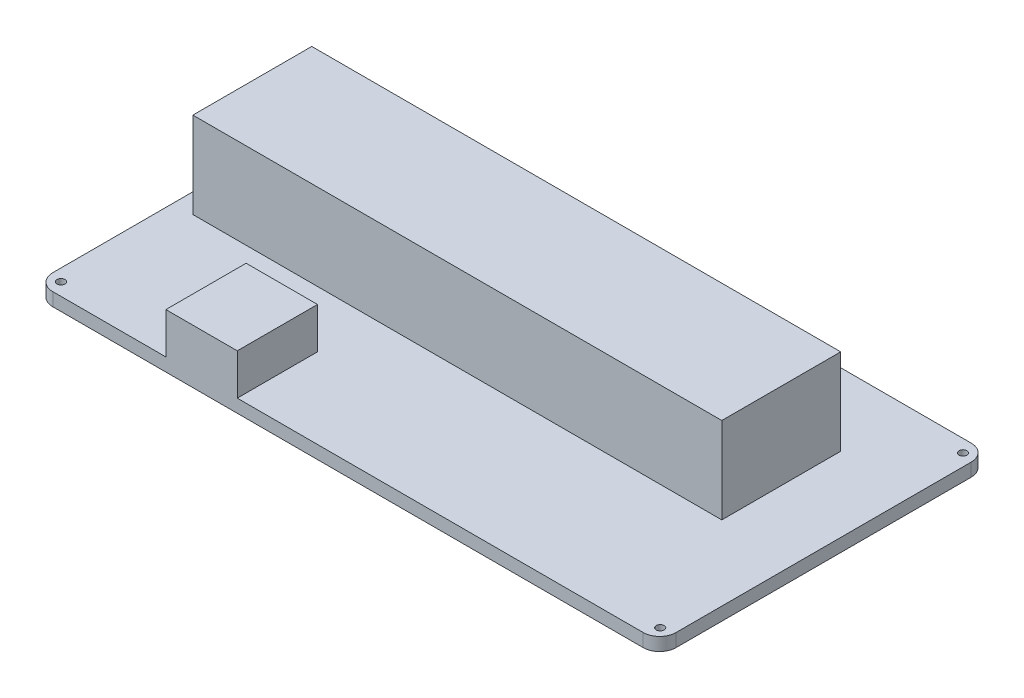
ISO-10303-21;
HEADER;
FILE_DESCRIPTION(('STEP AP214'),'2;1');
FILE_NAME('part.step','',(''),(''),'','','');
FILE_SCHEMA(('AUTOMOTIVE_DESIGN { 1 0 10303 214 1 1 1 1 }'));
ENDSEC;
DATA;
#1=APPLICATION_CONTEXT('core data for automotive mechanical design processes');
#2=APPLICATION_PROTOCOL_DEFINITION('international standard','automotive_design',2000,#1);
#3=PRODUCT_CONTEXT('',#1,'mechanical');
#4=PRODUCT('Part','Part','',(#3));
#5=PRODUCT_RELATED_PRODUCT_CATEGORY('part','',(#4));
#6=PRODUCT_DEFINITION_FORMATION('','',#4);
#7=PRODUCT_DEFINITION_CONTEXT('part definition',#1,'design');
#8=PRODUCT_DEFINITION('design','',#6,#7);
#9=PRODUCT_DEFINITION_SHAPE('','',#8);
#10=(LENGTH_UNIT() NAMED_UNIT(*) SI_UNIT(.MILLI.,.METRE.));
#11=(NAMED_UNIT(*) PLANE_ANGLE_UNIT() SI_UNIT($,.RADIAN.));
#12=(NAMED_UNIT(*) SI_UNIT($,.STERADIAN.) SOLID_ANGLE_UNIT());
#13=UNCERTAINTY_MEASURE_WITH_UNIT(LENGTH_MEASURE(1.E-05),#10,'distance_accuracy_value','');
#14=(GEOMETRIC_REPRESENTATION_CONTEXT(3) GLOBAL_UNCERTAINTY_ASSIGNED_CONTEXT((#13)) GLOBAL_UNIT_ASSIGNED_CONTEXT((#10,
#11,#12)) REPRESENTATION_CONTEXT('',''));
#15=CARTESIAN_POINT('',(0.,0.,0.));
#16=DIRECTION('',(0.,0.,1.));
#17=DIRECTION('',(1.,0.,0.));
#18=AXIS2_PLACEMENT_3D('',#15,#16,#17);
#19=CARTESIAN_POINT('',(0.,1.6,0.));
#20=DIRECTION('',(0.,1.,0.));
#21=DIRECTION('',(0.,0.,1.));
#22=AXIS2_PLACEMENT_3D('',#19,#20,#21);
#23=PLANE('',#22);
#24=DIRECTION('',(1.,0.,0.));
#25=VECTOR('',#24,1.);
#26=CARTESIAN_POINT('',(0.,1.6,3.31710182875458));
#27=LINE('',#26,#25);
#28=CARTESIAN_POINT('',(-35.6,1.6,3.31710182875459));
#29=VERTEX_POINT('',#28);
#30=CARTESIAN_POINT('',(28.9,1.6,3.31710182875456));
#31=VERTEX_POINT('',#30);
#32=EDGE_CURVE('E269',#29,#31,#27,.T.);
#33=ORIENTED_EDGE('',*,*,#32,.F.);
#34=DIRECTION('',(0.,0.,1.));
#35=VECTOR('',#34,1.);
#36=CARTESIAN_POINT('',(-35.6,1.6,0.));
#37=LINE('',#36,#35);
#38=CARTESIAN_POINT('',(-35.6,1.6,-11.1828981712454));
#39=VERTEX_POINT('',#38);
#40=EDGE_CURVE('E266',#39,#29,#37,.T.);
#41=ORIENTED_EDGE('',*,*,#40,.F.);
#42=DIRECTION('',(1.,0.,0.));
#43=VECTOR('',#42,1.);
#44=CARTESIAN_POINT('',(0.,1.6,-11.1828981712454));
#45=LINE('',#44,#43);
#46=CARTESIAN_POINT('',(28.9,1.6,-11.1828981712454));
#47=VERTEX_POINT('',#46);
#48=EDGE_CURVE('E262',#39,#47,#45,.T.);
#49=ORIENTED_EDGE('',*,*,#48,.T.);
#50=DIRECTION('',(0.,0.,1.));
#51=VECTOR('',#50,1.);
#52=CARTESIAN_POINT('',(28.9,1.6,0.));
#53=LINE('',#52,#51);
#54=EDGE_CURVE('E243',#47,#31,#53,.T.);
#55=ORIENTED_EDGE('',*,*,#54,.T.);
#56=EDGE_LOOP('',(#33,#41,#49,#55));
#57=FACE_BOUND('',#56,.T.);
#58=CARTESIAN_POINT('',(36.5339011806264,1.6,-18.4594263243894));
#59=DIRECTION('',(0.,1.,0.));
#60=DIRECTION('',(0.,0.,-1.));
#61=AXIS2_PLACEMENT_3D('',#58,#59,#60);
#62=CIRCLE('',#61,0.479748543202235);
#63=CARTESIAN_POINT('',(36.5339011806264,1.6,-18.9391748675916));
#64=VERTEX_POINT('',#63);
#65=EDGE_CURVE('E273',#64,#64,#62,.T.);
#66=ORIENTED_EDGE('',*,*,#65,.F.);
#67=EDGE_LOOP('',(#66));
#68=FACE_BOUND('',#67,.T.);
#69=CARTESIAN_POINT('',(36.5339011806264,1.6,18.4594263243894));
#70=DIRECTION('',(0.,-1.,0.));
#71=DIRECTION('',(0.,0.,1.));
#72=AXIS2_PLACEMENT_3D('',#69,#70,#71);
#73=CIRCLE('',#72,0.479748543202235);
#74=CARTESIAN_POINT('',(36.5339011806264,1.6,18.9391748675916));
#75=VERTEX_POINT('',#74);
#76=EDGE_CURVE('E278',#75,#75,#73,.T.);
#77=ORIENTED_EDGE('',*,*,#76,.T.);
#78=EDGE_LOOP('',(#77));
#79=FACE_BOUND('',#78,.T.);
#80=CARTESIAN_POINT('',(-36.5339011806264,1.6,-18.4594263243894));
#81=DIRECTION('',(0.,-1.,0.));
#82=DIRECTION('',(0.,0.,-1.));
#83=AXIS2_PLACEMENT_3D('',#80,#81,#82);
#84=CIRCLE('',#83,0.479748543202235);
#85=CARTESIAN_POINT('',(-36.5339011806264,1.6,-18.9391748675916));
#86=VERTEX_POINT('',#85);
#87=EDGE_CURVE('E286',#86,#86,#84,.T.);
#88=ORIENTED_EDGE('',*,*,#87,.T.);
#89=EDGE_LOOP('',(#88));
#90=FACE_BOUND('',#89,.T.);
#91=CARTESIAN_POINT('',(-36.5339011806264,1.6,18.4594263243894));
#92=DIRECTION('',(0.,1.,0.));
#93=DIRECTION('',(0.,0.,1.));
#94=AXIS2_PLACEMENT_3D('',#91,#92,#93);
#95=CIRCLE('',#94,0.479748543202235);
#96=CARTESIAN_POINT('',(-36.5339011806264,1.6,18.9391748675916));
#97=VERTEX_POINT('',#96);
#98=EDGE_CURVE('E294',#97,#97,#95,.T.);
#99=ORIENTED_EDGE('',*,*,#98,.F.);
#100=EDGE_LOOP('',(#99));
#101=FACE_BOUND('',#100,.T.);
#102=DIRECTION('',(-1.,0.,0.));
#103=VECTOR('',#102,1.);
#104=CARTESIAN_POINT('',(-13.5,1.6,10.2152470039414));
#105=LINE('',#104,#103);
#106=CARTESIAN_POINT('',(-13.5,1.6,10.2152470039414));
#107=VERTEX_POINT('',#106);
#108=CARTESIAN_POINT('',(-22.2075198077629,1.6,10.2152470039414));
#109=VERTEX_POINT('',#108);
#110=EDGE_CURVE('E57',#107,#109,#105,.T.);
#111=ORIENTED_EDGE('',*,*,#110,.F.);
#112=DIRECTION('',(0.,0.,-1.));
#113=VECTOR('',#112,1.);
#114=CARTESIAN_POINT('',(-13.5,1.6,10.2152470039414));
#115=LINE('',#114,#113);
#116=CARTESIAN_POINT('',(-13.5,1.6,20.));
#117=VERTEX_POINT('',#116);
#118=EDGE_CURVE('E200',#117,#107,#115,.T.);
#119=ORIENTED_EDGE('',*,*,#118,.F.);
#120=DIRECTION('',(1.,0.,0.));
#121=VECTOR('',#120,1.);
#122=CARTESIAN_POINT('',(-38.,1.6,20.));
#123=LINE('',#122,#121);
#124=CARTESIAN_POINT('',(36.,1.6,20.));
#125=VERTEX_POINT('',#124);
#126=EDGE_CURVE('E319',#117,#125,#123,.T.);
#127=ORIENTED_EDGE('',*,*,#126,.T.);
#128=CARTESIAN_POINT('',(36.,1.6,18.));
#129=DIRECTION('',(0.,1.,0.));
#130=DIRECTION('',(0.,0.,1.));
#131=AXIS2_PLACEMENT_3D('',#128,#129,#130);
#132=CIRCLE('',#131,2.);
#133=CARTESIAN_POINT('',(38.,1.6,18.));
#134=VERTEX_POINT('',#133);
#135=EDGE_CURVE('E369',#125,#134,#132,.T.);
#136=ORIENTED_EDGE('',*,*,#135,.T.);
#137=DIRECTION('',(0.,0.,-1.));
#138=VECTOR('',#137,1.);
#139=CARTESIAN_POINT('',(38.,1.6,-20.));
#140=LINE('',#139,#138);
#141=CARTESIAN_POINT('',(38.,1.6,-18.));
#142=VERTEX_POINT('',#141);
#143=EDGE_CURVE('E306',#134,#142,#140,.T.);
#144=ORIENTED_EDGE('',*,*,#143,.T.);
#145=CARTESIAN_POINT('',(36.,1.6,-18.));
#146=DIRECTION('',(0.,1.,0.));
#147=DIRECTION('',(0.,0.,1.));
#148=AXIS2_PLACEMENT_3D('',#145,#146,#147);
#149=CIRCLE('',#148,2.);
#150=CARTESIAN_POINT('',(36.,1.6,-20.));
#151=VERTEX_POINT('',#150);
#152=EDGE_CURVE('E372',#142,#151,#149,.T.);
#153=ORIENTED_EDGE('',*,*,#152,.T.);
#154=DIRECTION('',(-1.,0.,0.));
#155=VECTOR('',#154,1.);
#156=CARTESIAN_POINT('',(-38.,1.6,-20.));
#157=LINE('',#156,#155);
#158=CARTESIAN_POINT('',(-36.,1.6,-20.));
#159=VERTEX_POINT('',#158);
#160=EDGE_CURVE('E310',#151,#159,#157,.T.);
#161=ORIENTED_EDGE('',*,*,#160,.T.);
#162=CARTESIAN_POINT('',(-36.,1.6,-18.));
#163=DIRECTION('',(0.,1.,0.));
#164=DIRECTION('',(0.,0.,1.));
#165=AXIS2_PLACEMENT_3D('',#162,#163,#164);
#166=CIRCLE('',#165,2.);
#167=CARTESIAN_POINT('',(-38.,1.6,-18.));
#168=VERTEX_POINT('',#167);
#169=EDGE_CURVE('E366',#159,#168,#166,.T.);
#170=ORIENTED_EDGE('',*,*,#169,.T.);
#171=DIRECTION('',(0.,0.,1.));
#172=VECTOR('',#171,1.);
#173=CARTESIAN_POINT('',(-38.,1.6,-20.));
#174=LINE('',#173,#172);
#175=CARTESIAN_POINT('',(-38.,1.6,18.));
#176=VERTEX_POINT('',#175);
#177=EDGE_CURVE('E315',#168,#176,#174,.T.);
#178=ORIENTED_EDGE('',*,*,#177,.T.);
#179=CARTESIAN_POINT('',(-36.,1.6,18.));
#180=DIRECTION('',(0.,1.,0.));
#181=DIRECTION('',(0.,0.,1.));
#182=AXIS2_PLACEMENT_3D('',#179,#180,#181);
#183=CIRCLE('',#182,2.);
#184=CARTESIAN_POINT('',(-36.,1.6,20.));
#185=VERTEX_POINT('',#184);
#186=EDGE_CURVE('E363',#176,#185,#183,.T.);
#187=ORIENTED_EDGE('',*,*,#186,.T.);
#188=CARTESIAN_POINT('',(-22.2075198077629,1.6,20.));
#189=VERTEX_POINT('',#188);
#190=EDGE_CURVE('E320',#185,#189,#123,.T.);
#191=ORIENTED_EDGE('',*,*,#190,.T.);
#192=DIRECTION('',(0.,0.,1.));
#193=VECTOR('',#192,1.);
#194=CARTESIAN_POINT('',(-22.2075198077629,1.6,10.2152470039414));
#195=LINE('',#194,#193);
#196=EDGE_CURVE('E62',#109,#189,#195,.T.);
#197=ORIENTED_EDGE('',*,*,#196,.F.);
#198=EDGE_LOOP('',(#111,#119,#127,#136,#144,#153,#161,#170,#178,#187,#191,#197));
#199=FACE_BOUND('',#198,.T.);
#200=ADVANCED_FACE('F41',(#57,#68,#79,#90,#101,#199),#23,.T.);
#201=CARTESIAN_POINT('',(38.,1.6,-20.));
#202=DIRECTION('',(-1.,0.,0.));
#203=DIRECTION('',(0.,0.,1.));
#204=AXIS2_PLACEMENT_3D('',#201,#202,#203);
#205=PLANE('',#204);
#206=DIRECTION('',(0.,0.,-1.));
#207=VECTOR('',#206,1.);
#208=CARTESIAN_POINT('',(38.,0.,-20.));
#209=LINE('',#208,#207);
#210=CARTESIAN_POINT('',(38.,0.,18.));
#211=VERTEX_POINT('',#210);
#212=CARTESIAN_POINT('',(38.,0.,-18.));
#213=VERTEX_POINT('',#212);
#214=EDGE_CURVE('E302',#211,#213,#209,.T.);
#215=ORIENTED_EDGE('',*,*,#214,.T.);
#216=DIRECTION('',(0.,-1.,0.));
#217=VECTOR('',#216,1.);
#218=CARTESIAN_POINT('',(38.,1.6,-18.));
#219=LINE('',#218,#217);
#220=EDGE_CURVE('E360',#213,#142,#219,.F.);
#221=ORIENTED_EDGE('',*,*,#220,.T.);
#222=ORIENTED_EDGE('',*,*,#143,.F.);
#223=DIRECTION('',(0.,-1.,0.));
#224=VECTOR('',#223,1.);
#225=CARTESIAN_POINT('',(38.,1.6,18.));
#226=LINE('',#225,#224);
#227=EDGE_CURVE('E356',#134,#211,#226,.T.);
#228=ORIENTED_EDGE('',*,*,#227,.T.);
#229=EDGE_LOOP('',(#215,#221,#222,#228));
#230=FACE_BOUND('',#229,.T.);
#231=ADVANCED_FACE('F433',(#230),#205,.F.);
#232=CARTESIAN_POINT('',(-38.,1.6,-20.));
#233=DIRECTION('',(0.,0.,1.));
#234=DIRECTION('',(1.,0.,0.));
#235=AXIS2_PLACEMENT_3D('',#232,#233,#234);
#236=PLANE('',#235);
#237=ORIENTED_EDGE('',*,*,#160,.F.);
#238=DIRECTION('',(0.,-1.,0.));
#239=VECTOR('',#238,1.);
#240=CARTESIAN_POINT('',(36.,1.6,-20.));
#241=LINE('',#240,#239);
#242=CARTESIAN_POINT('',(36.,0.,-20.));
#243=VERTEX_POINT('',#242);
#244=EDGE_CURVE('E340',#151,#243,#241,.T.);
#245=ORIENTED_EDGE('',*,*,#244,.T.);
#246=DIRECTION('',(-1.,0.,0.));
#247=VECTOR('',#246,1.);
#248=CARTESIAN_POINT('',(-38.,0.,-20.));
#249=LINE('',#248,#247);
#250=CARTESIAN_POINT('',(-36.,0.,-20.));
#251=VERTEX_POINT('',#250);
#252=EDGE_CURVE('E327',#243,#251,#249,.T.);
#253=ORIENTED_EDGE('',*,*,#252,.T.);
#254=DIRECTION('',(0.,-1.,0.));
#255=VECTOR('',#254,1.);
#256=CARTESIAN_POINT('',(-36.,1.6,-20.));
#257=LINE('',#256,#255);
#258=EDGE_CURVE('E323',#251,#159,#257,.F.);
#259=ORIENTED_EDGE('',*,*,#258,.T.);
#260=EDGE_LOOP('',(#237,#245,#253,#259));
#261=FACE_BOUND('',#260,.T.);
#262=ADVANCED_FACE('F439',(#261),#236,.F.);
#263=CARTESIAN_POINT('',(-38.,1.6,-20.));
#264=DIRECTION('',(1.,0.,0.));
#265=DIRECTION('',(0.,0.,-1.));
#266=AXIS2_PLACEMENT_3D('',#263,#264,#265);
#267=PLANE('',#266);
#268=ORIENTED_EDGE('',*,*,#177,.F.);
#269=DIRECTION('',(0.,-1.,0.));
#270=VECTOR('',#269,1.);
#271=CARTESIAN_POINT('',(-38.,1.6,-18.));
#272=LINE('',#271,#270);
#273=CARTESIAN_POINT('',(-38.,0.,-18.));
#274=VERTEX_POINT('',#273);
#275=EDGE_CURVE('E386',#168,#274,#272,.T.);
#276=ORIENTED_EDGE('',*,*,#275,.T.);
#277=DIRECTION('',(0.,0.,1.));
#278=VECTOR('',#277,1.);
#279=CARTESIAN_POINT('',(-38.,0.,-20.));
#280=LINE('',#279,#278);
#281=CARTESIAN_POINT('',(-38.,0.,18.));
#282=VERTEX_POINT('',#281);
#283=EDGE_CURVE('E331',#274,#282,#280,.T.);
#284=ORIENTED_EDGE('',*,*,#283,.T.);
#285=DIRECTION('',(0.,-1.,0.));
#286=VECTOR('',#285,1.);
#287=CARTESIAN_POINT('',(-38.,1.6,18.));
#288=LINE('',#287,#286);
#289=EDGE_CURVE('E383',#282,#176,#288,.F.);
#290=ORIENTED_EDGE('',*,*,#289,.T.);
#291=EDGE_LOOP('',(#268,#276,#284,#290));
#292=FACE_BOUND('',#291,.T.);
#293=ADVANCED_FACE('F454',(#292),#267,.F.);
#294=CARTESIAN_POINT('',(-38.,1.6,20.));
#295=DIRECTION('',(0.,0.,-1.));
#296=DIRECTION('',(-1.,0.,0.));
#297=AXIS2_PLACEMENT_3D('',#294,#295,#296);
#298=PLANE('',#297);
#299=DIRECTION('',(1.,0.,0.));
#300=VECTOR('',#299,1.);
#301=CARTESIAN_POINT('',(-38.,0.,20.));
#302=LINE('',#301,#300);
#303=CARTESIAN_POINT('',(-36.,0.,20.));
#304=VERTEX_POINT('',#303);
#305=CARTESIAN_POINT('',(36.,0.,20.));
#306=VERTEX_POINT('',#305);
#307=EDGE_CURVE('E311',#304,#306,#302,.T.);
#308=ORIENTED_EDGE('',*,*,#307,.T.);
#309=DIRECTION('',(0.,-1.,0.));
#310=VECTOR('',#309,1.);
#311=CARTESIAN_POINT('',(36.,1.6,20.));
#312=LINE('',#311,#310);
#313=EDGE_CURVE('E379',#306,#125,#312,.F.);
#314=ORIENTED_EDGE('',*,*,#313,.T.);
#315=ORIENTED_EDGE('',*,*,#126,.F.);
#316=DIRECTION('',(0.,-1.,0.));
#317=VECTOR('',#316,1.);
#318=CARTESIAN_POINT('',(-13.5,6.6,20.));
#319=LINE('',#318,#317);
#320=CARTESIAN_POINT('',(-13.5,6.6,20.));
#321=VERTEX_POINT('',#320);
#322=EDGE_CURVE('E490',#321,#117,#319,.T.);
#323=ORIENTED_EDGE('',*,*,#322,.F.);
#324=DIRECTION('',(1.,0.,0.));
#325=VECTOR('',#324,1.);
#326=CARTESIAN_POINT('',(-13.5,6.6,20.));
#327=LINE('',#326,#325);
#328=CARTESIAN_POINT('',(-22.2075198077629,6.6,20.));
#329=VERTEX_POINT('',#328);
#330=EDGE_CURVE('E193',#329,#321,#327,.T.);
#331=ORIENTED_EDGE('',*,*,#330,.F.);
#332=DIRECTION('',(0.,-1.,0.));
#333=VECTOR('',#332,1.);
#334=CARTESIAN_POINT('',(-22.2075198077629,6.6,20.));
#335=LINE('',#334,#333);
#336=EDGE_CURVE('E209',#329,#189,#335,.T.);
#337=ORIENTED_EDGE('',*,*,#336,.T.);
#338=ORIENTED_EDGE('',*,*,#190,.F.);
#339=DIRECTION('',(0.,-1.,0.));
#340=VECTOR('',#339,1.);
#341=CARTESIAN_POINT('',(-36.,1.6,20.));
#342=LINE('',#341,#340);
#343=EDGE_CURVE('E375',#185,#304,#342,.T.);
#344=ORIENTED_EDGE('',*,*,#343,.T.);
#345=EDGE_LOOP('',(#308,#314,#315,#323,#331,#337,#338,#344));
#346=FACE_BOUND('',#345,.T.);
#347=ADVANCED_FACE('F451',(#346),#298,.F.);
#348=CARTESIAN_POINT('',(0.,0.,0.));
#349=DIRECTION('',(0.,1.,0.));
#350=DIRECTION('',(0.,0.,1.));
#351=AXIS2_PLACEMENT_3D('',#348,#349,#350);
#352=PLANE('',#351);
#353=DIRECTION('',(0.,0.,1.));
#354=VECTOR('',#353,1.);
#355=CARTESIAN_POINT('',(-35.6,0.,0.));
#356=LINE('',#355,#354);
#357=CARTESIAN_POINT('',(-35.6,0.,-11.1828981712454));
#358=VERTEX_POINT('',#357);
#359=CARTESIAN_POINT('',(-35.6,0.,3.31710182875459));
#360=VERTEX_POINT('',#359);
#361=EDGE_CURVE('E50',#358,#360,#356,.T.);
#362=ORIENTED_EDGE('',*,*,#361,.T.);
#363=DIRECTION('',(1.,0.,0.));
#364=VECTOR('',#363,1.);
#365=CARTESIAN_POINT('',(0.,0.,3.31710182875458));
#366=LINE('',#365,#364);
#367=CARTESIAN_POINT('',(28.9,0.,3.31710182875456));
#368=VERTEX_POINT('',#367);
#369=EDGE_CURVE('E11',#360,#368,#366,.T.);
#370=ORIENTED_EDGE('',*,*,#369,.T.);
#371=DIRECTION('',(0.,0.,1.));
#372=VECTOR('',#371,1.);
#373=CARTESIAN_POINT('',(28.9,0.,0.));
#374=LINE('',#373,#372);
#375=CARTESIAN_POINT('',(28.9,0.,-11.1828981712454));
#376=VERTEX_POINT('',#375);
#377=EDGE_CURVE('E390',#376,#368,#374,.T.);
#378=ORIENTED_EDGE('',*,*,#377,.F.);
#379=DIRECTION('',(1.,0.,0.));
#380=VECTOR('',#379,1.);
#381=CARTESIAN_POINT('',(0.,0.,-11.1828981712454));
#382=LINE('',#381,#380);
#383=EDGE_CURVE('E394',#358,#376,#382,.T.);
#384=ORIENTED_EDGE('',*,*,#383,.F.);
#385=EDGE_LOOP('',(#362,#370,#378,#384));
#386=FACE_BOUND('',#385,.T.);
#387=CARTESIAN_POINT('',(36.5339011806264,0.,-18.4594263243894));
#388=DIRECTION('',(0.,1.,0.));
#389=DIRECTION('',(0.,0.,-1.));
#390=AXIS2_PLACEMENT_3D('',#387,#388,#389);
#391=CIRCLE('',#390,0.479748543202235);
#392=CARTESIAN_POINT('',(36.5339011806264,0.,-18.9391748675916));
#393=VERTEX_POINT('',#392);
#394=EDGE_CURVE('E274',#393,#393,#391,.T.);
#395=ORIENTED_EDGE('',*,*,#394,.T.);
#396=EDGE_LOOP('',(#395));
#397=FACE_BOUND('',#396,.T.);
#398=CARTESIAN_POINT('',(36.5339011806264,0.,18.4594263243894));
#399=DIRECTION('',(0.,-1.,0.));
#400=DIRECTION('',(0.,0.,1.));
#401=AXIS2_PLACEMENT_3D('',#398,#399,#400);
#402=CIRCLE('',#401,0.479748543202235);
#403=CARTESIAN_POINT('',(36.5339011806264,0.,18.9391748675916));
#404=VERTEX_POINT('',#403);
#405=EDGE_CURVE('E282',#404,#404,#402,.T.);
#406=ORIENTED_EDGE('',*,*,#405,.F.);
#407=EDGE_LOOP('',(#406));
#408=FACE_BOUND('',#407,.T.);
#409=CARTESIAN_POINT('',(-36.5339011806264,0.,-18.4594263243894));
#410=DIRECTION('',(0.,-1.,0.));
#411=DIRECTION('',(0.,0.,-1.));
#412=AXIS2_PLACEMENT_3D('',#409,#410,#411);
#413=CIRCLE('',#412,0.479748543202235);
#414=CARTESIAN_POINT('',(-36.5339011806264,0.,-18.9391748675916));
#415=VERTEX_POINT('',#414);
#416=EDGE_CURVE('E290',#415,#415,#413,.T.);
#417=ORIENTED_EDGE('',*,*,#416,.F.);
#418=EDGE_LOOP('',(#417));
#419=FACE_BOUND('',#418,.T.);
#420=CARTESIAN_POINT('',(-36.5339011806264,0.,18.4594263243894));
#421=DIRECTION('',(0.,1.,0.));
#422=DIRECTION('',(0.,0.,1.));
#423=AXIS2_PLACEMENT_3D('',#420,#421,#422);
#424=CIRCLE('',#423,0.479748543202235);
#425=CARTESIAN_POINT('',(-36.5339011806264,0.,18.9391748675916));
#426=VERTEX_POINT('',#425);
#427=EDGE_CURVE('E298',#426,#426,#424,.T.);
#428=ORIENTED_EDGE('',*,*,#427,.T.);
#429=EDGE_LOOP('',(#428));
#430=FACE_BOUND('',#429,.T.);
#431=ORIENTED_EDGE('',*,*,#252,.F.);
#432=CARTESIAN_POINT('',(36.,0.,-18.));
#433=DIRECTION('',(0.,1.,0.));
#434=DIRECTION('',(0.,0.,1.));
#435=AXIS2_PLACEMENT_3D('',#432,#433,#434);
#436=CIRCLE('',#435,2.);
#437=EDGE_CURVE('E353',#243,#213,#436,.F.);
#438=ORIENTED_EDGE('',*,*,#437,.T.);
#439=ORIENTED_EDGE('',*,*,#214,.F.);
#440=CARTESIAN_POINT('',(36.,0.,18.));
#441=DIRECTION('',(0.,1.,0.));
#442=DIRECTION('',(0.,0.,1.));
#443=AXIS2_PLACEMENT_3D('',#440,#441,#442);
#444=CIRCLE('',#443,2.);
#445=EDGE_CURVE('E350',#211,#306,#444,.F.);
#446=ORIENTED_EDGE('',*,*,#445,.T.);
#447=ORIENTED_EDGE('',*,*,#307,.F.);
#448=CARTESIAN_POINT('',(-36.,0.,18.));
#449=DIRECTION('',(0.,1.,0.));
#450=DIRECTION('',(0.,0.,1.));
#451=AXIS2_PLACEMENT_3D('',#448,#449,#450);
#452=CIRCLE('',#451,2.);
#453=EDGE_CURVE('E344',#304,#282,#452,.F.);
#454=ORIENTED_EDGE('',*,*,#453,.T.);
#455=ORIENTED_EDGE('',*,*,#283,.F.);
#456=CARTESIAN_POINT('',(-36.,0.,-18.));
#457=DIRECTION('',(0.,1.,0.));
#458=DIRECTION('',(0.,0.,1.));
#459=AXIS2_PLACEMENT_3D('',#456,#457,#458);
#460=CIRCLE('',#459,2.);
#461=EDGE_CURVE('E347',#274,#251,#460,.F.);
#462=ORIENTED_EDGE('',*,*,#461,.T.);
#463=EDGE_LOOP('',(#431,#438,#439,#446,#447,#454,#455,#462));
#464=FACE_BOUND('',#463,.T.);
#465=ADVANCED_FACE('F401',(#386,#397,#408,#419,#430,#464),#352,.F.);
#466=CARTESIAN_POINT('',(36.,1.6,-18.));
#467=DIRECTION('',(0.,-1.,0.));
#468=DIRECTION('',(0.,0.,-1.));
#469=AXIS2_PLACEMENT_3D('',#466,#467,#468);
#470=CYLINDRICAL_SURFACE('',#469,2.);
#471=ORIENTED_EDGE('',*,*,#152,.F.);
#472=ORIENTED_EDGE('',*,*,#220,.F.);
#473=ORIENTED_EDGE('',*,*,#437,.F.);
#474=ORIENTED_EDGE('',*,*,#244,.F.);
#475=EDGE_LOOP('',(#471,#472,#473,#474));
#476=FACE_BOUND('',#475,.T.);
#477=ADVANCED_FACE('F450',(#476),#470,.T.);
#478=CARTESIAN_POINT('',(36.,1.6,18.));
#479=DIRECTION('',(0.,-1.,0.));
#480=DIRECTION('',(0.,0.,-1.));
#481=AXIS2_PLACEMENT_3D('',#478,#479,#480);
#482=CYLINDRICAL_SURFACE('',#481,2.);
#483=ORIENTED_EDGE('',*,*,#135,.F.);
#484=ORIENTED_EDGE('',*,*,#313,.F.);
#485=ORIENTED_EDGE('',*,*,#445,.F.);
#486=ORIENTED_EDGE('',*,*,#227,.F.);
#487=EDGE_LOOP('',(#483,#484,#485,#486));
#488=FACE_BOUND('',#487,.T.);
#489=ADVANCED_FACE('F464',(#488),#482,.T.);
#490=CARTESIAN_POINT('',(-36.,1.6,-18.));
#491=DIRECTION('',(0.,-1.,0.));
#492=DIRECTION('',(0.,0.,-1.));
#493=AXIS2_PLACEMENT_3D('',#490,#491,#492);
#494=CYLINDRICAL_SURFACE('',#493,2.);
#495=ORIENTED_EDGE('',*,*,#169,.F.);
#496=ORIENTED_EDGE('',*,*,#258,.F.);
#497=ORIENTED_EDGE('',*,*,#461,.F.);
#498=ORIENTED_EDGE('',*,*,#275,.F.);
#499=EDGE_LOOP('',(#495,#496,#497,#498));
#500=FACE_BOUND('',#499,.T.);
#501=ADVANCED_FACE('F467',(#500),#494,.T.);
#502=CARTESIAN_POINT('',(-36.,1.6,18.));
#503=DIRECTION('',(0.,-1.,0.));
#504=DIRECTION('',(0.,0.,-1.));
#505=AXIS2_PLACEMENT_3D('',#502,#503,#504);
#506=CYLINDRICAL_SURFACE('',#505,2.);
#507=ORIENTED_EDGE('',*,*,#186,.F.);
#508=ORIENTED_EDGE('',*,*,#289,.F.);
#509=ORIENTED_EDGE('',*,*,#453,.F.);
#510=ORIENTED_EDGE('',*,*,#343,.F.);
#511=EDGE_LOOP('',(#507,#508,#509,#510));
#512=FACE_BOUND('',#511,.T.);
#513=ADVANCED_FACE('F43',(#512),#506,.T.);
#514=CARTESIAN_POINT('',(-36.5339011806264,0.,18.4594263243894));
#515=DIRECTION('',(0.,1.,0.));
#516=DIRECTION('',(0.,0.,1.));
#517=AXIS2_PLACEMENT_3D('',#514,#515,#516);
#518=CYLINDRICAL_SURFACE('',#517,0.479748543202235);
#519=ORIENTED_EDGE('',*,*,#427,.F.);
#520=EDGE_LOOP('',(#519));
#521=FACE_BOUND('',#520,.T.);
#522=ORIENTED_EDGE('',*,*,#98,.T.);
#523=EDGE_LOOP('',(#522));
#524=FACE_BOUND('',#523,.T.);
#525=ADVANCED_FACE('F446',(#521,#524),#518,.F.);
#526=CARTESIAN_POINT('',(-36.5339011806264,0.,-18.4594263243894));
#527=DIRECTION('',(0.,1.,0.));
#528=DIRECTION('',(0.,0.,1.));
#529=AXIS2_PLACEMENT_3D('',#526,#527,#528);
#530=CYLINDRICAL_SURFACE('',#529,0.479748543202235);
#531=ORIENTED_EDGE('',*,*,#416,.T.);
#532=EDGE_LOOP('',(#531));
#533=FACE_BOUND('',#532,.T.);
#534=ORIENTED_EDGE('',*,*,#87,.F.);
#535=EDGE_LOOP('',(#534));
#536=FACE_BOUND('',#535,.T.);
#537=ADVANCED_FACE('F551',(#533,#536),#530,.F.);
#538=CARTESIAN_POINT('',(36.5339011806264,0.,18.4594263243894));
#539=DIRECTION('',(0.,1.,0.));
#540=DIRECTION('',(0.,0.,1.));
#541=AXIS2_PLACEMENT_3D('',#538,#539,#540);
#542=CYLINDRICAL_SURFACE('',#541,0.479748543202235);
#543=ORIENTED_EDGE('',*,*,#405,.T.);
#544=EDGE_LOOP('',(#543));
#545=FACE_BOUND('',#544,.T.);
#546=ORIENTED_EDGE('',*,*,#76,.F.);
#547=EDGE_LOOP('',(#546));
#548=FACE_BOUND('',#547,.T.);
#549=ADVANCED_FACE('F548',(#545,#548),#542,.F.);
#550=CARTESIAN_POINT('',(36.5339011806264,0.,-18.4594263243894));
#551=DIRECTION('',(0.,1.,0.));
#552=DIRECTION('',(0.,0.,1.));
#553=AXIS2_PLACEMENT_3D('',#550,#551,#552);
#554=CYLINDRICAL_SURFACE('',#553,0.479748543202235);
#555=ORIENTED_EDGE('',*,*,#394,.F.);
#556=EDGE_LOOP('',(#555));
#557=FACE_BOUND('',#556,.T.);
#558=ORIENTED_EDGE('',*,*,#65,.T.);
#559=EDGE_LOOP('',(#558));
#560=FACE_BOUND('',#559,.T.);
#561=ADVANCED_FACE('F520',(#557,#560),#554,.F.);
#562=CARTESIAN_POINT('',(0.,-1.4,0.));
#563=DIRECTION('',(0.,-1.,0.));
#564=DIRECTION('',(0.,0.,-1.));
#565=AXIS2_PLACEMENT_3D('',#562,#563,#564);
#566=PLANE('',#565);
#567=DIRECTION('',(1.,0.,0.));
#568=VECTOR('',#567,1.);
#569=CARTESIAN_POINT('',(-35.6,-1.4,3.31710182875459));
#570=LINE('',#569,#568);
#571=CARTESIAN_POINT('',(-35.6,-1.4,3.31710182875459));
#572=VERTEX_POINT('',#571);
#573=CARTESIAN_POINT('',(28.9,-1.4,3.31710182875456));
#574=VERTEX_POINT('',#573);
#575=EDGE_CURVE('E224',#572,#574,#570,.T.);
#576=ORIENTED_EDGE('',*,*,#575,.F.);
#577=DIRECTION('',(0.,0.,1.));
#578=VECTOR('',#577,1.);
#579=CARTESIAN_POINT('',(-35.6,-1.4,-11.1828981712454));
#580=LINE('',#579,#578);
#581=CARTESIAN_POINT('',(-35.6,-1.4,-11.1828981712454));
#582=VERTEX_POINT('',#581);
#583=EDGE_CURVE('E234',#582,#572,#580,.T.);
#584=ORIENTED_EDGE('',*,*,#583,.F.);
#585=DIRECTION('',(1.,0.,0.));
#586=VECTOR('',#585,1.);
#587=CARTESIAN_POINT('',(-35.6,-1.4,-11.1828981712454));
#588=LINE('',#587,#586);
#589=CARTESIAN_POINT('',(28.9,-1.4,-11.1828981712454));
#590=VERTEX_POINT('',#589);
#591=EDGE_CURVE('E231',#582,#590,#588,.T.);
#592=ORIENTED_EDGE('',*,*,#591,.T.);
#593=DIRECTION('',(0.,0.,1.));
#594=VECTOR('',#593,1.);
#595=CARTESIAN_POINT('',(28.9,-1.4,-11.1828981712454));
#596=LINE('',#595,#594);
#597=EDGE_CURVE('E228',#590,#574,#596,.T.);
#598=ORIENTED_EDGE('',*,*,#597,.T.);
#599=EDGE_LOOP('',(#576,#584,#592,#598));
#600=FACE_BOUND('',#599,.T.);
#601=ADVANCED_FACE('F412',(#600),#566,.T.);
#602=CARTESIAN_POINT('',(28.9,-1.4,-11.1828981712454));
#603=DIRECTION('',(-1.,0.,0.));
#604=DIRECTION('',(0.,0.,1.));
#605=AXIS2_PLACEMENT_3D('',#602,#603,#604);
#606=PLANE('',#605);
#607=DIRECTION('',(0.,1.,0.));
#608=VECTOR('',#607,1.);
#609=CARTESIAN_POINT('',(28.9,-1.4,-11.1828981712454));
#610=LINE('',#609,#608);
#611=EDGE_CURVE('E250',#590,#376,#610,.T.);
#612=ORIENTED_EDGE('',*,*,#611,.T.);
#613=ORIENTED_EDGE('',*,*,#377,.T.);
#614=DIRECTION('',(0.,1.,0.));
#615=VECTOR('',#614,1.);
#616=CARTESIAN_POINT('',(28.9,-1.4,3.31710182875456));
#617=LINE('',#616,#615);
#618=EDGE_CURVE('E255',#574,#368,#617,.T.);
#619=ORIENTED_EDGE('',*,*,#618,.F.);
#620=ORIENTED_EDGE('',*,*,#597,.F.);
#621=EDGE_LOOP('',(#612,#613,#619,#620));
#622=FACE_BOUND('',#621,.T.);
#623=ADVANCED_FACE('F416',(#622),#606,.F.);
#624=CARTESIAN_POINT('',(-35.6,-1.4,-11.1828981712454));
#625=DIRECTION('',(0.,0.,1.));
#626=DIRECTION('',(1.,0.,0.));
#627=AXIS2_PLACEMENT_3D('',#624,#625,#626);
#628=PLANE('',#627);
#629=DIRECTION('',(0.,1.,0.));
#630=VECTOR('',#629,1.);
#631=CARTESIAN_POINT('',(-35.6,-1.4,-11.1828981712454));
#632=LINE('',#631,#630);
#633=EDGE_CURVE('E245',#582,#358,#632,.T.);
#634=ORIENTED_EDGE('',*,*,#633,.T.);
#635=ORIENTED_EDGE('',*,*,#383,.T.);
#636=ORIENTED_EDGE('',*,*,#611,.F.);
#637=ORIENTED_EDGE('',*,*,#591,.F.);
#638=EDGE_LOOP('',(#634,#635,#636,#637));
#639=FACE_BOUND('',#638,.T.);
#640=ADVANCED_FACE('F418',(#639),#628,.F.);
#641=CARTESIAN_POINT('',(-35.6,-1.4,-11.1828981712454));
#642=DIRECTION('',(-1.,0.,0.));
#643=DIRECTION('',(0.,0.,1.));
#644=AXIS2_PLACEMENT_3D('',#641,#642,#643);
#645=PLANE('',#644);
#646=ORIENTED_EDGE('',*,*,#361,.F.);
#647=ORIENTED_EDGE('',*,*,#633,.F.);
#648=ORIENTED_EDGE('',*,*,#583,.T.);
#649=DIRECTION('',(0.,1.,0.));
#650=VECTOR('',#649,1.);
#651=CARTESIAN_POINT('',(-35.6,-1.4,3.31710182875459));
#652=LINE('',#651,#650);
#653=EDGE_CURVE('E239',#572,#360,#652,.T.);
#654=ORIENTED_EDGE('',*,*,#653,.T.);
#655=EDGE_LOOP('',(#646,#647,#648,#654));
#656=FACE_BOUND('',#655,.T.);
#657=ADVANCED_FACE('F408',(#656),#645,.T.);
#658=CARTESIAN_POINT('',(-35.6,-1.4,3.31710182875459));
#659=DIRECTION('',(0.,0.,1.));
#660=DIRECTION('',(1.,0.,0.));
#661=AXIS2_PLACEMENT_3D('',#658,#659,#660);
#662=PLANE('',#661);
#663=ORIENTED_EDGE('',*,*,#369,.F.);
#664=ORIENTED_EDGE('',*,*,#653,.F.);
#665=ORIENTED_EDGE('',*,*,#575,.T.);
#666=ORIENTED_EDGE('',*,*,#618,.T.);
#667=EDGE_LOOP('',(#663,#664,#665,#666));
#668=FACE_BOUND('',#667,.T.);
#669=ADVANCED_FACE('F405',(#668),#662,.T.);
#670=CARTESIAN_POINT('',(-35.6,12.1,3.31710182875459));
#671=VERTEX_POINT('',#670);
#672=EDGE_CURVE('E244',#29,#671,#652,.T.);
#673=ORIENTED_EDGE('',*,*,#672,.F.);
#674=ORIENTED_EDGE('',*,*,#32,.T.);
#675=CARTESIAN_POINT('',(28.9,12.1,3.31710182875456));
#676=VERTEX_POINT('',#675);
#677=EDGE_CURVE('E238',#31,#676,#617,.T.);
#678=ORIENTED_EDGE('',*,*,#677,.T.);
#679=DIRECTION('',(1.,0.,0.));
#680=VECTOR('',#679,1.);
#681=CARTESIAN_POINT('',(-35.6,12.1,3.31710182875459));
#682=LINE('',#681,#680);
#683=EDGE_CURVE('E202',#671,#676,#682,.T.);
#684=ORIENTED_EDGE('',*,*,#683,.F.);
#685=EDGE_LOOP('',(#673,#674,#678,#684));
#686=FACE_BOUND('',#685,.T.);
#687=ADVANCED_FACE('F522',(#686),#662,.T.);
#688=CARTESIAN_POINT('',(-35.6,12.1,-11.1828981712454));
#689=VERTEX_POINT('',#688);
#690=EDGE_CURVE('E249',#39,#689,#632,.T.);
#691=ORIENTED_EDGE('',*,*,#690,.F.);
#692=ORIENTED_EDGE('',*,*,#40,.T.);
#693=ORIENTED_EDGE('',*,*,#672,.T.);
#694=DIRECTION('',(0.,0.,1.));
#695=VECTOR('',#694,1.);
#696=CARTESIAN_POINT('',(-35.6,12.1,-11.1828981712454));
#697=LINE('',#696,#695);
#698=EDGE_CURVE('E220',#689,#671,#697,.T.);
#699=ORIENTED_EDGE('',*,*,#698,.F.);
#700=EDGE_LOOP('',(#691,#692,#693,#699));
#701=FACE_BOUND('',#700,.T.);
#702=ADVANCED_FACE('F427',(#701),#645,.T.);
#703=ORIENTED_EDGE('',*,*,#48,.F.);
#704=ORIENTED_EDGE('',*,*,#690,.T.);
#705=DIRECTION('',(1.,0.,0.));
#706=VECTOR('',#705,1.);
#707=CARTESIAN_POINT('',(-35.6,12.1,-11.1828981712454));
#708=LINE('',#707,#706);
#709=CARTESIAN_POINT('',(28.9,12.1,-11.1828981712454));
#710=VERTEX_POINT('',#709);
#711=EDGE_CURVE('E216',#689,#710,#708,.T.);
#712=ORIENTED_EDGE('',*,*,#711,.T.);
#713=EDGE_CURVE('E254',#47,#710,#610,.T.);
#714=ORIENTED_EDGE('',*,*,#713,.F.);
#715=EDGE_LOOP('',(#703,#704,#712,#714));
#716=FACE_BOUND('',#715,.T.);
#717=ADVANCED_FACE('F421',(#716),#628,.F.);
#718=ORIENTED_EDGE('',*,*,#54,.F.);
#719=ORIENTED_EDGE('',*,*,#713,.T.);
#720=DIRECTION('',(0.,0.,1.));
#721=VECTOR('',#720,1.);
#722=CARTESIAN_POINT('',(28.9,12.1,-11.1828981712454));
#723=LINE('',#722,#721);
#724=EDGE_CURVE('E207',#710,#676,#723,.T.);
#725=ORIENTED_EDGE('',*,*,#724,.T.);
#726=ORIENTED_EDGE('',*,*,#677,.F.);
#727=EDGE_LOOP('',(#718,#719,#725,#726));
#728=FACE_BOUND('',#727,.T.);
#729=ADVANCED_FACE('F429',(#728),#606,.F.);
#730=CARTESIAN_POINT('',(0.,12.1,0.));
#731=DIRECTION('',(0.,-1.,0.));
#732=DIRECTION('',(0.,0.,-1.));
#733=AXIS2_PLACEMENT_3D('',#730,#731,#732);
#734=PLANE('',#733);
#735=ORIENTED_EDGE('',*,*,#683,.T.);
#736=ORIENTED_EDGE('',*,*,#724,.F.);
#737=ORIENTED_EDGE('',*,*,#711,.F.);
#738=ORIENTED_EDGE('',*,*,#698,.T.);
#739=EDGE_LOOP('',(#735,#736,#737,#738));
#740=FACE_BOUND('',#739,.T.);
#741=ADVANCED_FACE('F515',(#740),#734,.F.);
#742=CARTESIAN_POINT('',(-13.5,6.6,10.2152470039414));
#743=DIRECTION('',(-1.,0.,0.));
#744=DIRECTION('',(0.,0.,1.));
#745=AXIS2_PLACEMENT_3D('',#742,#743,#744);
#746=PLANE('',#745);
#747=ORIENTED_EDGE('',*,*,#118,.T.);
#748=DIRECTION('',(0.,-1.,0.));
#749=VECTOR('',#748,1.);
#750=CARTESIAN_POINT('',(-13.5,6.6,10.2152470039414));
#751=LINE('',#750,#749);
#752=CARTESIAN_POINT('',(-13.5,6.6,10.2152470039414));
#753=VERTEX_POINT('',#752);
#754=EDGE_CURVE('E180',#753,#107,#751,.T.);
#755=ORIENTED_EDGE('',*,*,#754,.F.);
#756=DIRECTION('',(0.,0.,-1.));
#757=VECTOR('',#756,1.);
#758=CARTESIAN_POINT('',(-13.5,6.6,10.2152470039414));
#759=LINE('',#758,#757);
#760=EDGE_CURVE('E188',#321,#753,#759,.T.);
#761=ORIENTED_EDGE('',*,*,#760,.F.);
#762=ORIENTED_EDGE('',*,*,#322,.T.);
#763=EDGE_LOOP('',(#747,#755,#761,#762));
#764=FACE_BOUND('',#763,.T.);
#765=ADVANCED_FACE('F199',(#764),#746,.F.);
#766=CARTESIAN_POINT('',(-13.5,6.6,10.2152470039414));
#767=DIRECTION('',(0.,0.,1.));
#768=DIRECTION('',(1.,0.,0.));
#769=AXIS2_PLACEMENT_3D('',#766,#767,#768);
#770=PLANE('',#769);
#771=ORIENTED_EDGE('',*,*,#110,.T.);
#772=DIRECTION('',(0.,-1.,0.));
#773=VECTOR('',#772,1.);
#774=CARTESIAN_POINT('',(-22.2075198077629,6.6,10.2152470039414));
#775=LINE('',#774,#773);
#776=CARTESIAN_POINT('',(-22.2075198077629,6.6,10.2152470039414));
#777=VERTEX_POINT('',#776);
#778=EDGE_CURVE('E183',#777,#109,#775,.T.);
#779=ORIENTED_EDGE('',*,*,#778,.F.);
#780=DIRECTION('',(-1.,0.,0.));
#781=VECTOR('',#780,1.);
#782=CARTESIAN_POINT('',(-13.5,6.6,10.2152470039414));
#783=LINE('',#782,#781);
#784=EDGE_CURVE('E176',#753,#777,#783,.T.);
#785=ORIENTED_EDGE('',*,*,#784,.F.);
#786=ORIENTED_EDGE('',*,*,#754,.T.);
#787=EDGE_LOOP('',(#771,#779,#785,#786));
#788=FACE_BOUND('',#787,.T.);
#789=ADVANCED_FACE('F178',(#788),#770,.F.);
#790=CARTESIAN_POINT('',(-22.2075198077629,6.6,10.2152470039414));
#791=DIRECTION('',(1.,0.,0.));
#792=DIRECTION('',(0.,0.,-1.));
#793=AXIS2_PLACEMENT_3D('',#790,#791,#792);
#794=PLANE('',#793);
#795=ORIENTED_EDGE('',*,*,#196,.T.);
#796=ORIENTED_EDGE('',*,*,#336,.F.);
#797=DIRECTION('',(0.,0.,1.));
#798=VECTOR('',#797,1.);
#799=CARTESIAN_POINT('',(-22.2075198077629,6.6,10.2152470039414));
#800=LINE('',#799,#798);
#801=EDGE_CURVE('E187',#777,#329,#800,.T.);
#802=ORIENTED_EDGE('',*,*,#801,.F.);
#803=ORIENTED_EDGE('',*,*,#778,.T.);
#804=EDGE_LOOP('',(#795,#796,#802,#803));
#805=FACE_BOUND('',#804,.T.);
#806=ADVANCED_FACE('F503',(#805),#794,.F.);
#807=CARTESIAN_POINT('',(0.,6.6,0.));
#808=DIRECTION('',(0.,-1.,0.));
#809=DIRECTION('',(0.,0.,-1.));
#810=AXIS2_PLACEMENT_3D('',#807,#808,#809);
#811=PLANE('',#810);
#812=ORIENTED_EDGE('',*,*,#760,.T.);
#813=ORIENTED_EDGE('',*,*,#784,.T.);
#814=ORIENTED_EDGE('',*,*,#801,.T.);
#815=ORIENTED_EDGE('',*,*,#330,.T.);
#816=EDGE_LOOP('',(#812,#813,#814,#815));
#817=FACE_BOUND('',#816,.T.);
#818=ADVANCED_FACE('F191',(#817),#811,.F.);
#819=CLOSED_SHELL('',(#200,#231,#262,#293,#347,#465,#477,#489,#501,#513,#525,#537,#549,#561,
#601,#623,#640,#657,#669,#687,#702,#717,#729,#741,#765,#789,#806,#818));
#820=MANIFOLD_SOLID_BREP('B2',#819);
#821=ADVANCED_BREP_SHAPE_REPRESENTATION('',(#18,#820),#14);
#822=SHAPE_DEFINITION_REPRESENTATION(#9,#821);
ENDSEC;
END-ISO-10303-21;
